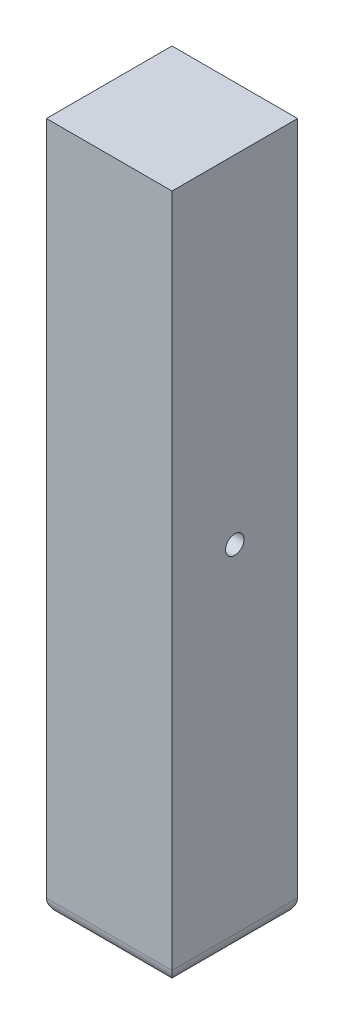
ISO-10303-21;
HEADER;
FILE_DESCRIPTION(('STEP AP214'),'2;1');
FILE_NAME('part.step','',(''),(''),'','','');
FILE_SCHEMA(('AUTOMOTIVE_DESIGN { 1 0 10303 214 1 1 1 1 }'));
ENDSEC;
DATA;
#1=APPLICATION_CONTEXT('core data for automotive mechanical design processes');
#2=APPLICATION_PROTOCOL_DEFINITION('international standard','automotive_design',2000,#1);
#3=PRODUCT_CONTEXT('',#1,'mechanical');
#4=PRODUCT('Part','Part','',(#3));
#5=PRODUCT_RELATED_PRODUCT_CATEGORY('part','',(#4));
#6=PRODUCT_DEFINITION_FORMATION('','',#4);
#7=PRODUCT_DEFINITION_CONTEXT('part definition',#1,'design');
#8=PRODUCT_DEFINITION('design','',#6,#7);
#9=PRODUCT_DEFINITION_SHAPE('','',#8);
#10=(LENGTH_UNIT() NAMED_UNIT(*) SI_UNIT(.MILLI.,.METRE.));
#11=(NAMED_UNIT(*) PLANE_ANGLE_UNIT() SI_UNIT($,.RADIAN.));
#12=(NAMED_UNIT(*) SI_UNIT($,.STERADIAN.) SOLID_ANGLE_UNIT());
#13=UNCERTAINTY_MEASURE_WITH_UNIT(LENGTH_MEASURE(1.E-05),#10,'distance_accuracy_value','');
#14=(GEOMETRIC_REPRESENTATION_CONTEXT(3) GLOBAL_UNCERTAINTY_ASSIGNED_CONTEXT((#13)) GLOBAL_UNIT_ASSIGNED_CONTEXT((#10,
#11,#12)) REPRESENTATION_CONTEXT('',''));
#15=CARTESIAN_POINT('',(0.,0.,0.));
#16=DIRECTION('',(0.,0.,1.));
#17=DIRECTION('',(1.,0.,0.));
#18=AXIS2_PLACEMENT_3D('',#15,#16,#17);
#19=CARTESIAN_POINT('',(0.,0.,101.6));
#20=DIRECTION('',(1.,0.,0.));
#21=DIRECTION('',(0.,0.,-1.));
#22=AXIS2_PLACEMENT_3D('',#19,#20,#21);
#23=PLANE('',#22);
#24=CARTESIAN_POINT('',(0.,285.75,50.8));
#25=DIRECTION('',(-1.,0.,0.));
#26=DIRECTION('',(0.,0.,1.));
#27=AXIS2_PLACEMENT_3D('',#24,#25,#26);
#28=CIRCLE('',#27,11.915);
#29=CARTESIAN_POINT('',(0.,285.75,62.715));
#30=VERTEX_POINT('',#29);
#31=EDGE_CURVE('E339',#30,#30,#28,.T.);
#32=ORIENTED_EDGE('',*,*,#31,.F.);
#33=EDGE_LOOP('',(#32));
#34=FACE_BOUND('',#33,.T.);
#35=DIRECTION('',(0.,-1.,0.));
#36=VECTOR('',#35,1.);
#37=CARTESIAN_POINT('',(0.,0.,0.));
#38=LINE('',#37,#36);
#39=CARTESIAN_POINT('',(0.,558.8,0.));
#40=VERTEX_POINT('',#39);
#41=CARTESIAN_POINT('',(0.,12.7,0.));
#42=VERTEX_POINT('',#41);
#43=EDGE_CURVE('E121',#40,#42,#38,.T.);
#44=ORIENTED_EDGE('',*,*,#43,.T.);
#45=DIRECTION('',(0.,0.,-1.));
#46=VECTOR('',#45,1.);
#47=CARTESIAN_POINT('',(0.,12.7,101.6));
#48=LINE('',#47,#46);
#49=CARTESIAN_POINT('',(0.,12.7,101.6));
#50=VERTEX_POINT('',#49);
#51=EDGE_CURVE('E142',#42,#50,#48,.F.);
#52=ORIENTED_EDGE('',*,*,#51,.T.);
#53=DIRECTION('',(0.,-1.,0.));
#54=VECTOR('',#53,1.);
#55=CARTESIAN_POINT('',(0.,0.,101.6));
#56=LINE('',#55,#54);
#57=CARTESIAN_POINT('',(0.,558.8,101.6));
#58=VERTEX_POINT('',#57);
#59=EDGE_CURVE('E100',#58,#50,#56,.T.);
#60=ORIENTED_EDGE('',*,*,#59,.F.);
#61=DIRECTION('',(0.,0.,-1.));
#62=VECTOR('',#61,1.);
#63=CARTESIAN_POINT('',(0.,558.8,101.6));
#64=LINE('',#63,#62);
#65=EDGE_CURVE('E110',#58,#40,#64,.T.);
#66=ORIENTED_EDGE('',*,*,#65,.T.);
#67=EDGE_LOOP('',(#44,#52,#60,#66));
#68=FACE_BOUND('',#67,.T.);
#69=ADVANCED_FACE('F42',(#34,#68),#23,.F.);
#70=CARTESIAN_POINT('',(0.,0.,101.6));
#71=DIRECTION('',(0.,1.,0.));
#72=DIRECTION('',(0.,0.,1.));
#73=AXIS2_PLACEMENT_3D('',#70,#71,#72);
#74=PLANE('',#73);
#75=DIRECTION('',(1.,0.,0.));
#76=VECTOR('',#75,1.);
#77=CARTESIAN_POINT('',(0.,0.,88.9));
#78=LINE('',#77,#76);
#79=CARTESIAN_POINT('',(88.9,0.,88.9));
#80=VERTEX_POINT('',#79);
#81=CARTESIAN_POINT('',(12.7,0.,88.9));
#82=VERTEX_POINT('',#81);
#83=EDGE_CURVE('E132',#80,#82,#78,.F.);
#84=ORIENTED_EDGE('',*,*,#83,.T.);
#85=DIRECTION('',(0.,0.,-1.));
#86=VECTOR('',#85,1.);
#87=CARTESIAN_POINT('',(12.7,0.,101.6));
#88=LINE('',#87,#86);
#89=CARTESIAN_POINT('',(12.7,0.,12.7));
#90=VERTEX_POINT('',#89);
#91=EDGE_CURVE('E138',#82,#90,#88,.T.);
#92=ORIENTED_EDGE('',*,*,#91,.T.);
#93=DIRECTION('',(1.,0.,0.));
#94=VECTOR('',#93,1.);
#95=CARTESIAN_POINT('',(101.6,0.,12.7));
#96=LINE('',#95,#94);
#97=CARTESIAN_POINT('',(88.9,0.,12.7));
#98=VERTEX_POINT('',#97);
#99=EDGE_CURVE('E135',#90,#98,#96,.T.);
#100=ORIENTED_EDGE('',*,*,#99,.T.);
#101=DIRECTION('',(0.,0.,-1.));
#102=VECTOR('',#101,1.);
#103=CARTESIAN_POINT('',(88.9,0.,101.6));
#104=LINE('',#103,#102);
#105=EDGE_CURVE('E109',#98,#80,#104,.F.);
#106=ORIENTED_EDGE('',*,*,#105,.T.);
#107=EDGE_LOOP('',(#84,#92,#100,#106));
#108=FACE_BOUND('',#107,.T.);
#109=ADVANCED_FACE('F184',(#108),#74,.F.);
#110=CARTESIAN_POINT('',(101.6,0.,101.6));
#111=DIRECTION('',(-1.,0.,0.));
#112=DIRECTION('',(0.,-1.,0.));
#113=AXIS2_PLACEMENT_3D('',#110,#111,#112);
#114=PLANE('',#113);
#115=CARTESIAN_POINT('',(101.6,285.75,50.8));
#116=DIRECTION('',(-1.,0.,0.));
#117=DIRECTION('',(0.,-1.,0.));
#118=AXIS2_PLACEMENT_3D('',#115,#116,#117);
#119=CIRCLE('',#118,7.49999999999998);
#120=CARTESIAN_POINT('',(101.6,278.25,50.8));
#121=VERTEX_POINT('',#120);
#122=EDGE_CURVE('E155',#121,#121,#119,.T.);
#123=ORIENTED_EDGE('',*,*,#122,.T.);
#124=EDGE_LOOP('',(#123));
#125=FACE_BOUND('',#124,.T.);
#126=DIRECTION('',(0.,1.,0.));
#127=VECTOR('',#126,1.);
#128=CARTESIAN_POINT('',(101.6,0.,101.6));
#129=LINE('',#128,#127);
#130=CARTESIAN_POINT('',(101.6,12.7,101.6));
#131=VERTEX_POINT('',#130);
#132=CARTESIAN_POINT('',(101.6,558.8,101.6));
#133=VERTEX_POINT('',#132);
#134=EDGE_CURVE('E93',#131,#133,#129,.T.);
#135=ORIENTED_EDGE('',*,*,#134,.F.);
#136=DIRECTION('',(0.,0.,-1.));
#137=VECTOR('',#136,1.);
#138=CARTESIAN_POINT('',(101.6,12.7,101.6));
#139=LINE('',#138,#137);
#140=CARTESIAN_POINT('',(101.6,12.7,0.));
#141=VERTEX_POINT('',#140);
#142=EDGE_CURVE('E11',#131,#141,#139,.T.);
#143=ORIENTED_EDGE('',*,*,#142,.T.);
#144=DIRECTION('',(0.,1.,0.));
#145=VECTOR('',#144,1.);
#146=CARTESIAN_POINT('',(101.6,0.,0.));
#147=LINE('',#146,#145);
#148=CARTESIAN_POINT('',(101.6,558.8,0.));
#149=VERTEX_POINT('',#148);
#150=EDGE_CURVE('E105',#141,#149,#147,.T.);
#151=ORIENTED_EDGE('',*,*,#150,.T.);
#152=DIRECTION('',(0.,0.,-1.));
#153=VECTOR('',#152,1.);
#154=CARTESIAN_POINT('',(101.6,558.8,101.6));
#155=LINE('',#154,#153);
#156=EDGE_CURVE('E103',#133,#149,#155,.T.);
#157=ORIENTED_EDGE('',*,*,#156,.F.);
#158=EDGE_LOOP('',(#135,#143,#151,#157));
#159=FACE_BOUND('',#158,.T.);
#160=ADVANCED_FACE('F104',(#125,#159),#114,.F.);
#161=CARTESIAN_POINT('',(0.,558.8,101.6));
#162=DIRECTION('',(0.,-1.,0.));
#163=DIRECTION('',(0.,0.,-1.));
#164=AXIS2_PLACEMENT_3D('',#161,#162,#163);
#165=PLANE('',#164);
#166=DIRECTION('',(-1.,0.,0.));
#167=VECTOR('',#166,1.);
#168=CARTESIAN_POINT('',(0.,558.8,0.));
#169=LINE('',#168,#167);
#170=EDGE_CURVE('E127',#149,#40,#169,.T.);
#171=ORIENTED_EDGE('',*,*,#170,.T.);
#172=ORIENTED_EDGE('',*,*,#65,.F.);
#173=DIRECTION('',(-1.,0.,0.));
#174=VECTOR('',#173,1.);
#175=CARTESIAN_POINT('',(0.,558.8,101.6));
#176=LINE('',#175,#174);
#177=EDGE_CURVE('E97',#133,#58,#176,.T.);
#178=ORIENTED_EDGE('',*,*,#177,.F.);
#179=ORIENTED_EDGE('',*,*,#156,.T.);
#180=EDGE_LOOP('',(#171,#172,#178,#179));
#181=FACE_BOUND('',#180,.T.);
#182=ADVANCED_FACE('F112',(#181),#165,.F.);
#183=CARTESIAN_POINT('',(0.,0.,101.6));
#184=DIRECTION('',(0.,0.,-1.));
#185=DIRECTION('',(-1.,0.,0.));
#186=AXIS2_PLACEMENT_3D('',#183,#184,#185);
#187=PLANE('',#186);
#188=ORIENTED_EDGE('',*,*,#59,.T.);
#189=DIRECTION('',(1.,0.,0.));
#190=VECTOR('',#189,1.);
#191=CARTESIAN_POINT('',(0.,12.7,101.6));
#192=LINE('',#191,#190);
#193=EDGE_CURVE('E52',#50,#131,#192,.T.);
#194=ORIENTED_EDGE('',*,*,#193,.T.);
#195=ORIENTED_EDGE('',*,*,#134,.T.);
#196=ORIENTED_EDGE('',*,*,#177,.T.);
#197=EDGE_LOOP('',(#188,#194,#195,#196));
#198=FACE_BOUND('',#197,.T.);
#199=ADVANCED_FACE('F95',(#198),#187,.F.);
#200=CARTESIAN_POINT('',(0.,0.,0.));
#201=DIRECTION('',(0.,0.,-1.));
#202=DIRECTION('',(-1.,0.,0.));
#203=AXIS2_PLACEMENT_3D('',#200,#201,#202);
#204=PLANE('',#203);
#205=ORIENTED_EDGE('',*,*,#150,.F.);
#206=DIRECTION('',(1.,0.,0.));
#207=VECTOR('',#206,1.);
#208=CARTESIAN_POINT('',(0.,12.7,0.));
#209=LINE('',#208,#207);
#210=EDGE_CURVE('E146',#141,#42,#209,.F.);
#211=ORIENTED_EDGE('',*,*,#210,.T.);
#212=ORIENTED_EDGE('',*,*,#43,.F.);
#213=ORIENTED_EDGE('',*,*,#170,.F.);
#214=EDGE_LOOP('',(#205,#211,#212,#213));
#215=FACE_BOUND('',#214,.T.);
#216=ADVANCED_FACE('F177',(#215),#204,.T.);
#217=CARTESIAN_POINT('',(88.9,12.7,101.6));
#218=DIRECTION('',(0.,0.,-1.));
#219=DIRECTION('',(-1.,0.,0.));
#220=AXIS2_PLACEMENT_3D('',#217,#218,#219);
#221=CYLINDRICAL_SURFACE('',#220,12.7);
#222=CARTESIAN_POINT('',(88.9,12.7,12.7));
#223=DIRECTION('',(-0.707106781186547,0.,-0.707106781186547));
#224=DIRECTION('',(0.707106781186547,0.,-0.707106781186547));
#225=AXIS2_PLACEMENT_3D('',#222,#223,#224);
#226=ELLIPSE('',#225,17.9605122421383,12.7);
#227=EDGE_CURVE('E157',#141,#98,#226,.T.);
#228=ORIENTED_EDGE('',*,*,#227,.F.);
#229=ORIENTED_EDGE('',*,*,#142,.F.);
#230=CARTESIAN_POINT('',(88.9,12.7,88.9));
#231=DIRECTION('',(0.707106781186547,0.,-0.707106781186547));
#232=DIRECTION('',(-0.707106781186547,0.,-0.707106781186547));
#233=AXIS2_PLACEMENT_3D('',#230,#231,#232);
#234=ELLIPSE('',#233,17.9605122421383,12.7);
#235=EDGE_CURVE('E46',#80,#131,#234,.F.);
#236=ORIENTED_EDGE('',*,*,#235,.F.);
#237=ORIENTED_EDGE('',*,*,#105,.F.);
#238=EDGE_LOOP('',(#228,#229,#236,#237));
#239=FACE_BOUND('',#238,.T.);
#240=ADVANCED_FACE('F44',(#239),#221,.T.);
#241=CARTESIAN_POINT('',(0.,12.7,88.9));
#242=DIRECTION('',(1.,0.,0.));
#243=DIRECTION('',(0.,0.,-1.));
#244=AXIS2_PLACEMENT_3D('',#241,#242,#243);
#245=CYLINDRICAL_SURFACE('',#244,12.7);
#246=ORIENTED_EDGE('',*,*,#235,.T.);
#247=ORIENTED_EDGE('',*,*,#193,.F.);
#248=CARTESIAN_POINT('',(12.7,12.7,88.9));
#249=DIRECTION('',(0.707106781186547,0.,0.707106781186547));
#250=DIRECTION('',(0.707106781186547,0.,-0.707106781186547));
#251=AXIS2_PLACEMENT_3D('',#248,#249,#250);
#252=ELLIPSE('',#251,17.9605122421383,12.7);
#253=EDGE_CURVE('E154',#82,#50,#252,.F.);
#254=ORIENTED_EDGE('',*,*,#253,.F.);
#255=ORIENTED_EDGE('',*,*,#83,.F.);
#256=EDGE_LOOP('',(#246,#247,#254,#255));
#257=FACE_BOUND('',#256,.T.);
#258=ADVANCED_FACE('F169',(#257),#245,.T.);
#259=CARTESIAN_POINT('',(0.,12.7,12.7));
#260=DIRECTION('',(-1.,0.,0.));
#261=DIRECTION('',(0.,0.,1.));
#262=AXIS2_PLACEMENT_3D('',#259,#260,#261);
#263=CYLINDRICAL_SURFACE('',#262,12.7);
#264=ORIENTED_EDGE('',*,*,#227,.T.);
#265=ORIENTED_EDGE('',*,*,#99,.F.);
#266=CARTESIAN_POINT('',(12.7,12.7,12.7));
#267=DIRECTION('',(-0.707106781186547,0.,0.707106781186547));
#268=DIRECTION('',(-0.707106781186547,0.,-0.707106781186547));
#269=AXIS2_PLACEMENT_3D('',#266,#267,#268);
#270=ELLIPSE('',#269,17.9605122421383,12.7);
#271=EDGE_CURVE('E151',#42,#90,#270,.T.);
#272=ORIENTED_EDGE('',*,*,#271,.F.);
#273=ORIENTED_EDGE('',*,*,#210,.F.);
#274=EDGE_LOOP('',(#264,#265,#272,#273));
#275=FACE_BOUND('',#274,.T.);
#276=ADVANCED_FACE('F174',(#275),#263,.T.);
#277=CARTESIAN_POINT('',(12.7,12.7,101.6));
#278=DIRECTION('',(0.,0.,-1.));
#279=DIRECTION('',(-1.,0.,0.));
#280=AXIS2_PLACEMENT_3D('',#277,#278,#279);
#281=CYLINDRICAL_SURFACE('',#280,12.7);
#282=ORIENTED_EDGE('',*,*,#253,.T.);
#283=ORIENTED_EDGE('',*,*,#51,.F.);
#284=ORIENTED_EDGE('',*,*,#271,.T.);
#285=ORIENTED_EDGE('',*,*,#91,.F.);
#286=EDGE_LOOP('',(#282,#283,#284,#285));
#287=FACE_BOUND('',#286,.T.);
#288=ADVANCED_FACE('F181',(#287),#281,.T.);
#289=CARTESIAN_POINT('',(0.,285.75,50.8));
#290=DIRECTION('',(-1.,0.,0.));
#291=DIRECTION('',(0.,0.,1.));
#292=AXIS2_PLACEMENT_3D('',#289,#290,#291);
#293=CYLINDRICAL_SURFACE('',#292,7.49999999999998);
#294=ORIENTED_EDGE('',*,*,#122,.F.);
#295=EDGE_LOOP('',(#294));
#296=FACE_BOUND('',#295,.T.);
#297=CARTESIAN_POINT('',(7.95,285.75,50.8));
#298=DIRECTION('',(-1.,0.,0.));
#299=DIRECTION('',(0.,0.,1.));
#300=AXIS2_PLACEMENT_3D('',#297,#298,#299);
#301=CIRCLE('',#300,7.50000000000001);
#302=CARTESIAN_POINT('',(7.95,285.75,58.3));
#303=VERTEX_POINT('',#302);
#304=EDGE_CURVE('E349',#303,#303,#301,.T.);
#305=ORIENTED_EDGE('',*,*,#304,.T.);
#306=EDGE_LOOP('',(#305));
#307=FACE_BOUND('',#306,.T.);
#308=ADVANCED_FACE('F201',(#296,#307),#293,.F.);
#309=CARTESIAN_POINT('',(7.95,297.64,50.8));
#310=DIRECTION('',(1.,0.,0.));
#311=DIRECTION('',(0.,0.,-1.));
#312=AXIS2_PLACEMENT_3D('',#309,#310,#311);
#313=PLANE('',#312);
#314=ORIENTED_EDGE('',*,*,#304,.F.);
#315=EDGE_LOOP('',(#314));
#316=FACE_BOUND('',#315,.T.);
#317=CARTESIAN_POINT('',(7.95,285.75,50.8));
#318=DIRECTION('',(-1.,0.,0.));
#319=DIRECTION('',(0.,0.,1.));
#320=AXIS2_PLACEMENT_3D('',#317,#318,#319);
#321=CIRCLE('',#320,11.89);
#322=CARTESIAN_POINT('',(7.95,285.75,62.69));
#323=VERTEX_POINT('',#322);
#324=EDGE_CURVE('E343',#323,#323,#321,.T.);
#325=ORIENTED_EDGE('',*,*,#324,.T.);
#326=EDGE_LOOP('',(#325));
#327=FACE_BOUND('',#326,.T.);
#328=ADVANCED_FACE('F270',(#316,#327),#313,.F.);
#329=CARTESIAN_POINT('',(0.,285.75,50.8));
#330=DIRECTION('',(-1.,0.,0.));
#331=DIRECTION('',(0.,0.,1.));
#332=AXIS2_PLACEMENT_3D('',#329,#330,#331);
#333=CYLINDRICAL_SURFACE('',#332,11.89);
#334=ORIENTED_EDGE('',*,*,#324,.F.);
#335=EDGE_LOOP('',(#334));
#336=FACE_BOUND('',#335,.T.);
#337=CARTESIAN_POINT('',(0.0250000000000031,285.75,50.8));
#338=DIRECTION('',(-1.,0.,0.));
#339=DIRECTION('',(0.,0.,1.));
#340=AXIS2_PLACEMENT_3D('',#337,#338,#339);
#341=CIRCLE('',#340,11.89);
#342=CARTESIAN_POINT('',(0.0250000000000031,285.75,62.69));
#343=VERTEX_POINT('',#342);
#344=EDGE_CURVE('E336',#343,#343,#341,.T.);
#345=ORIENTED_EDGE('',*,*,#344,.T.);
#346=EDGE_LOOP('',(#345));
#347=FACE_BOUND('',#346,.T.);
#348=ADVANCED_FACE('F280',(#336,#347),#333,.F.);
#349=CARTESIAN_POINT('',(0.,285.75,50.8));
#350=DIRECTION('',(-1.,0.,0.));
#351=DIRECTION('',(0.,0.,1.));
#352=AXIS2_PLACEMENT_3D('',#349,#350,#351);
#353=CONICAL_SURFACE('',#352,11.915,0.785398163397331);
#354=ORIENTED_EDGE('',*,*,#344,.F.);
#355=EDGE_LOOP('',(#354));
#356=FACE_BOUND('',#355,.T.);
#357=ORIENTED_EDGE('',*,*,#31,.T.);
#358=EDGE_LOOP('',(#357));
#359=FACE_BOUND('',#358,.T.);
#360=ADVANCED_FACE('F291',(#356,#359),#353,.F.);
#361=CLOSED_SHELL('',(#69,#109,#160,#182,#199,#216,#240,#258,#276,#288,#308,#328,#348,#360));
#362=MANIFOLD_SOLID_BREP('B2',#361);
#363=ADVANCED_BREP_SHAPE_REPRESENTATION('',(#18,#362),#14);
#364=SHAPE_DEFINITION_REPRESENTATION(#9,#363);
ENDSEC;
END-ISO-10303-21;
